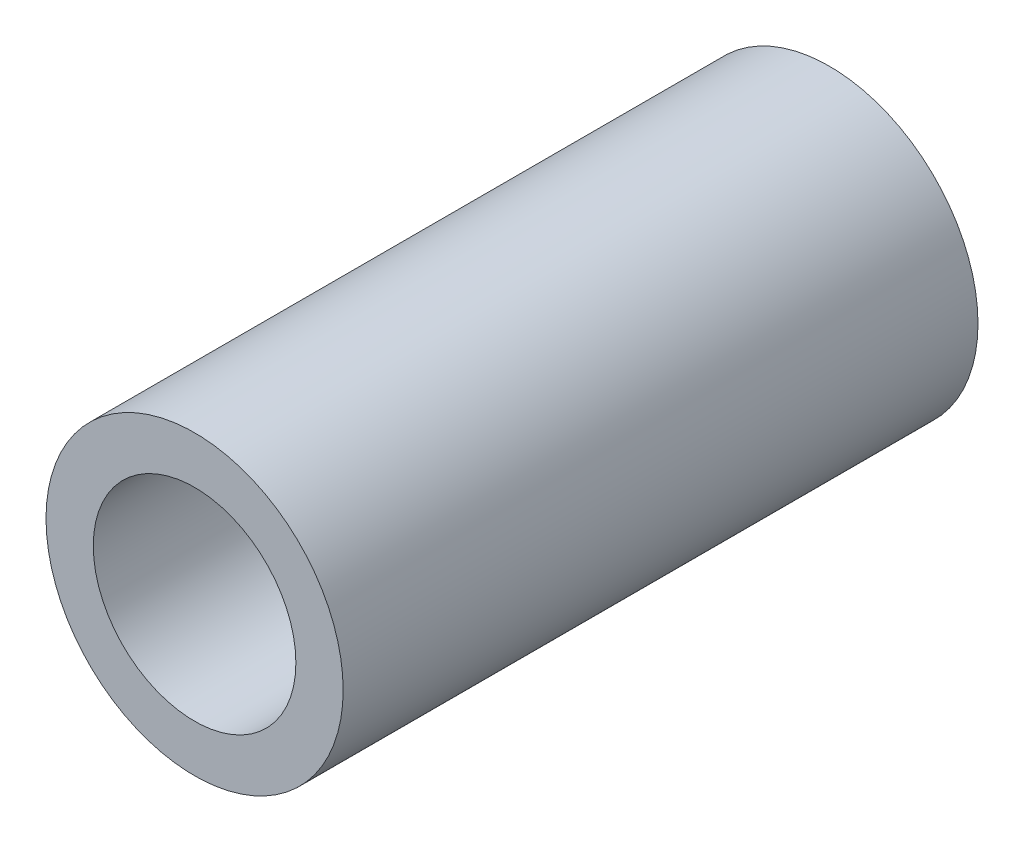
ISO-10303-21;
HEADER;
FILE_DESCRIPTION(('STEP AP214'),'2;1');
FILE_NAME('part.step','',(''),(''),'','','');
FILE_SCHEMA(('AUTOMOTIVE_DESIGN { 1 0 10303 214 1 1 1 1 }'));
ENDSEC;
DATA;
#1=APPLICATION_CONTEXT('core data for automotive mechanical design processes');
#2=APPLICATION_PROTOCOL_DEFINITION('international standard','automotive_design',2000,#1);
#3=PRODUCT_CONTEXT('',#1,'mechanical');
#4=PRODUCT('Part','Part','',(#3));
#5=PRODUCT_RELATED_PRODUCT_CATEGORY('part','',(#4));
#6=PRODUCT_DEFINITION_FORMATION('','',#4);
#7=PRODUCT_DEFINITION_CONTEXT('part definition',#1,'design');
#8=PRODUCT_DEFINITION('design','',#6,#7);
#9=PRODUCT_DEFINITION_SHAPE('','',#8);
#10=(LENGTH_UNIT() NAMED_UNIT(*) SI_UNIT(.MILLI.,.METRE.));
#11=(NAMED_UNIT(*) PLANE_ANGLE_UNIT() SI_UNIT($,.RADIAN.));
#12=(NAMED_UNIT(*) SI_UNIT($,.STERADIAN.) SOLID_ANGLE_UNIT());
#13=UNCERTAINTY_MEASURE_WITH_UNIT(LENGTH_MEASURE(1.E-05),#10,'distance_accuracy_value','');
#14=(GEOMETRIC_REPRESENTATION_CONTEXT(3) GLOBAL_UNCERTAINTY_ASSIGNED_CONTEXT((#13)) GLOBAL_UNIT_ASSIGNED_CONTEXT((#10,
#11,#12)) REPRESENTATION_CONTEXT('',''));
#15=CARTESIAN_POINT('',(0.,0.,0.));
#16=DIRECTION('',(0.,0.,1.));
#17=DIRECTION('',(1.,0.,0.));
#18=AXIS2_PLACEMENT_3D('',#15,#16,#17);
#19=CARTESIAN_POINT('',(0.,-11.,0.));
#20=DIRECTION('',(0.,0.,-1.));
#21=DIRECTION('',(-1.,0.,0.));
#22=AXIS2_PLACEMENT_3D('',#19,#20,#21);
#23=PLANE('',#22);
#24=CARTESIAN_POINT('',(0.,0.,0.));
#25=DIRECTION('',(0.,0.,1.));
#26=DIRECTION('',(1.,0.,0.));
#27=AXIS2_PLACEMENT_3D('',#24,#25,#26);
#28=CIRCLE('',#27,7.5);
#29=CARTESIAN_POINT('',(7.5,0.,0.));
#30=VERTEX_POINT('',#29);
#31=EDGE_CURVE('E10',#30,#30,#28,.T.);
#32=ORIENTED_EDGE('',*,*,#31,.T.);
#33=EDGE_LOOP('',(#32));
#34=FACE_BOUND('',#33,.T.);
#35=CARTESIAN_POINT('',(0.,0.,0.));
#36=DIRECTION('',(0.,0.,1.));
#37=DIRECTION('',(1.,0.,0.));
#38=AXIS2_PLACEMENT_3D('',#35,#36,#37);
#39=CIRCLE('',#38,11.);
#40=CARTESIAN_POINT('',(11.,0.,0.));
#41=VERTEX_POINT('',#40);
#42=EDGE_CURVE('E58',#41,#41,#39,.T.);
#43=ORIENTED_EDGE('',*,*,#42,.F.);
#44=EDGE_LOOP('',(#43));
#45=FACE_BOUND('',#44,.T.);
#46=ADVANCED_FACE('F39',(#34,#45),#23,.T.);
#47=CARTESIAN_POINT('',(0.,0.,33.8255033557047));
#48=DIRECTION('',(0.,0.,1.));
#49=DIRECTION('',(1.,0.,0.));
#50=AXIS2_PLACEMENT_3D('',#47,#48,#49);
#51=CYLINDRICAL_SURFACE('',#50,7.5);
#52=CARTESIAN_POINT('',(0.,0.,47.));
#53=DIRECTION('',(0.,0.,1.));
#54=DIRECTION('',(1.,0.,0.));
#55=AXIS2_PLACEMENT_3D('',#52,#53,#54);
#56=CIRCLE('',#55,7.50000000000001);
#57=CARTESIAN_POINT('',(7.50000000000001,0.,47.));
#58=VERTEX_POINT('',#57);
#59=EDGE_CURVE('E46',#58,#58,#56,.T.);
#60=ORIENTED_EDGE('',*,*,#59,.T.);
#61=EDGE_LOOP('',(#60));
#62=FACE_BOUND('',#61,.T.);
#63=ORIENTED_EDGE('',*,*,#31,.F.);
#64=EDGE_LOOP('',(#63));
#65=FACE_BOUND('',#64,.T.);
#66=ADVANCED_FACE('F70',(#62,#65),#51,.F.);
#67=CARTESIAN_POINT('',(0.,-7.50000000000001,47.));
#68=DIRECTION('',(0.,0.,1.));
#69=DIRECTION('',(1.,0.,0.));
#70=AXIS2_PLACEMENT_3D('',#67,#68,#69);
#71=PLANE('',#70);
#72=CARTESIAN_POINT('',(0.,0.,47.));
#73=DIRECTION('',(0.,0.,1.));
#74=DIRECTION('',(1.,0.,0.));
#75=AXIS2_PLACEMENT_3D('',#72,#73,#74);
#76=CIRCLE('',#75,11.);
#77=CARTESIAN_POINT('',(11.,0.,47.));
#78=VERTEX_POINT('',#77);
#79=EDGE_CURVE('E52',#78,#78,#76,.T.);
#80=ORIENTED_EDGE('',*,*,#79,.T.);
#81=EDGE_LOOP('',(#80));
#82=FACE_BOUND('',#81,.T.);
#83=ORIENTED_EDGE('',*,*,#59,.F.);
#84=EDGE_LOOP('',(#83));
#85=FACE_BOUND('',#84,.T.);
#86=ADVANCED_FACE('F74',(#82,#85),#71,.T.);
#87=CARTESIAN_POINT('',(0.,0.,33.8255033557047));
#88=DIRECTION('',(0.,0.,1.));
#89=DIRECTION('',(1.,0.,0.));
#90=AXIS2_PLACEMENT_3D('',#87,#88,#89);
#91=CYLINDRICAL_SURFACE('',#90,11.);
#92=ORIENTED_EDGE('',*,*,#42,.T.);
#93=EDGE_LOOP('',(#92));
#94=FACE_BOUND('',#93,.T.);
#95=ORIENTED_EDGE('',*,*,#79,.F.);
#96=EDGE_LOOP('',(#95));
#97=FACE_BOUND('',#96,.T.);
#98=ADVANCED_FACE('F66',(#94,#97),#91,.T.);
#99=CLOSED_SHELL('',(#46,#66,#86,#98));
#100=MANIFOLD_SOLID_BREP('B2',#99);
#101=ADVANCED_BREP_SHAPE_REPRESENTATION('',(#18,#100),#14);
#102=SHAPE_DEFINITION_REPRESENTATION(#9,#101);
ENDSEC;
END-ISO-10303-21;
